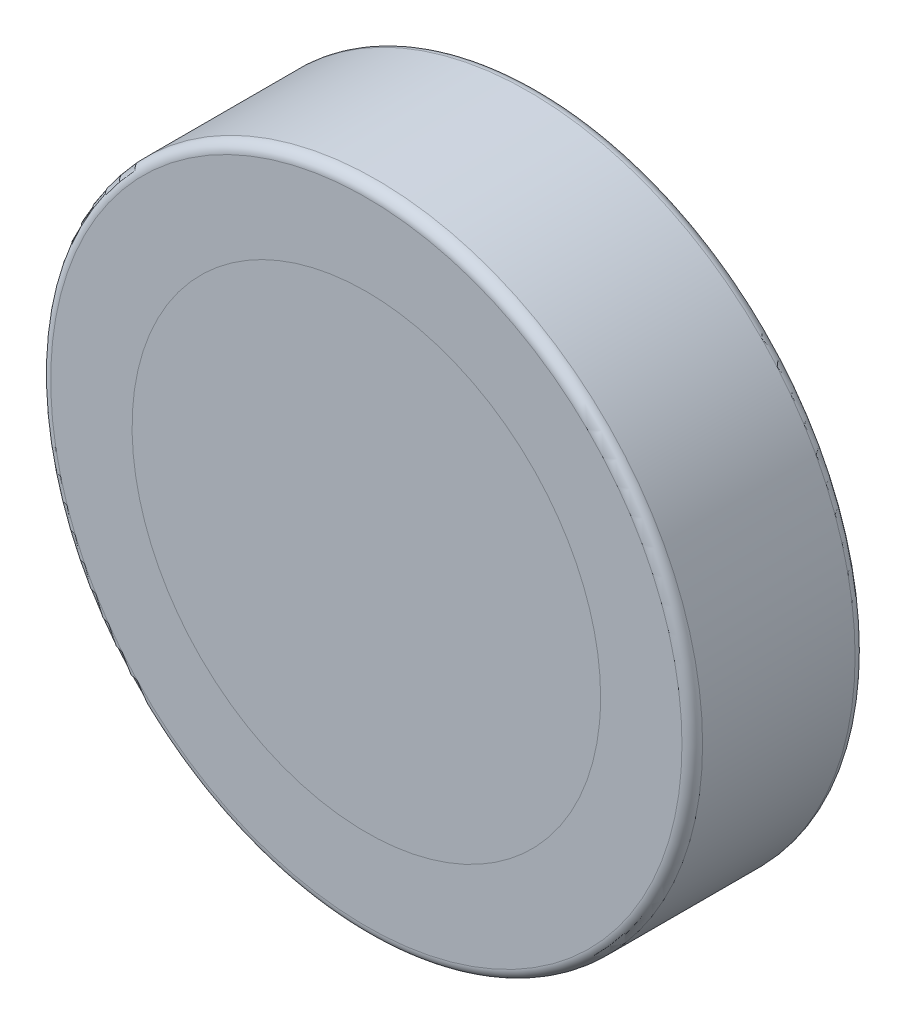
ISO-10303-21;
HEADER;
FILE_DESCRIPTION(('STEP AP214'),'2;1');
FILE_NAME('part.step','',(''),(''),'','','');
FILE_SCHEMA(('AUTOMOTIVE_DESIGN { 1 0 10303 214 1 1 1 1 }'));
ENDSEC;
DATA;
#1=APPLICATION_CONTEXT('core data for automotive mechanical design processes');
#2=APPLICATION_PROTOCOL_DEFINITION('international standard','automotive_design',2000,#1);
#3=PRODUCT_CONTEXT('',#1,'mechanical');
#4=PRODUCT('Part','Part','',(#3));
#5=PRODUCT_RELATED_PRODUCT_CATEGORY('part','',(#4));
#6=PRODUCT_DEFINITION_FORMATION('','',#4);
#7=PRODUCT_DEFINITION_CONTEXT('part definition',#1,'design');
#8=PRODUCT_DEFINITION('design','',#6,#7);
#9=PRODUCT_DEFINITION_SHAPE('','',#8);
#10=(LENGTH_UNIT() NAMED_UNIT(*) SI_UNIT(.MILLI.,.METRE.));
#11=(NAMED_UNIT(*) PLANE_ANGLE_UNIT() SI_UNIT($,.RADIAN.));
#12=(NAMED_UNIT(*) SI_UNIT($,.STERADIAN.) SOLID_ANGLE_UNIT());
#13=UNCERTAINTY_MEASURE_WITH_UNIT(LENGTH_MEASURE(1.E-05),#10,'distance_accuracy_value','');
#14=(GEOMETRIC_REPRESENTATION_CONTEXT(3) GLOBAL_UNCERTAINTY_ASSIGNED_CONTEXT((#13)) GLOBAL_UNIT_ASSIGNED_CONTEXT((#10,
#11,#12)) REPRESENTATION_CONTEXT('',''));
#15=CARTESIAN_POINT('',(0.,0.,0.));
#16=DIRECTION('',(0.,0.,1.));
#17=DIRECTION('',(1.,0.,0.));
#18=AXIS2_PLACEMENT_3D('',#15,#16,#17);
#19=CARTESIAN_POINT('',(0.,2.975,0.813747010949256));
#20=CARTESIAN_POINT('',(-2.975,2.975,0.813747010949256));
#21=CARTESIAN_POINT('',(-2.975,0.,0.813747010949256));
#22=CARTESIAN_POINT('',(-2.975,-2.975,0.813747010949256));
#23=CARTESIAN_POINT('',(0.,-2.975,0.813747010949256));
#24=CARTESIAN_POINT('',(2.975,-2.975,0.813747010949255));
#25=CARTESIAN_POINT('',(2.975,0.,0.813747010949255));
#26=CARTESIAN_POINT('',(2.975,2.975,0.813747010949255));
#27=CARTESIAN_POINT('',(0.,2.975,0.813747010949256));
#28=CARTESIAN_POINT('',(0.,2.95794835873586,0.808934722904776));
#29=CARTESIAN_POINT('',(-2.95794835873586,2.95794835873587,0.808934722904777));
#30=CARTESIAN_POINT('',(-2.95794835873587,0.,0.808934722904777));
#31=CARTESIAN_POINT('',(-2.95794835873587,-2.95794835873586,0.808934722904776));
#32=CARTESIAN_POINT('',(0.,-2.95794835873586,0.808934722904776));
#33=CARTESIAN_POINT('',(2.95794835873586,-2.95794835873587,0.808934722904776));
#34=CARTESIAN_POINT('',(2.95794835873586,0.,0.808934722904776));
#35=CARTESIAN_POINT('',(2.95794835873587,2.95794835873586,0.808934722904776));
#36=CARTESIAN_POINT('',(0.,2.95794835873586,0.808934722904776));
#37=CARTESIAN_POINT('',(0.,2.91872932603113,0.78127548100211));
#38=CARTESIAN_POINT('',(-2.91872932603113,2.91872932603113,0.78127548100211));
#39=CARTESIAN_POINT('',(-2.91872932603113,0.,0.78127548100211));
#40=CARTESIAN_POINT('',(-2.91872932603113,-2.91872932603113,0.78127548100211));
#41=CARTESIAN_POINT('',(0.,-2.91872932603113,0.78127548100211));
#42=CARTESIAN_POINT('',(2.91872932603113,-2.91872932603113,0.781275481002109));
#43=CARTESIAN_POINT('',(2.91872932603113,0.,0.781275481002109));
#44=CARTESIAN_POINT('',(2.91872932603113,2.91872932603113,0.781275481002109));
#45=CARTESIAN_POINT('',(0.,2.91872932603113,0.78127548100211));
#46=CARTESIAN_POINT('',(0.,2.86665441418622,0.754054575757818));
#47=CARTESIAN_POINT('',(-2.86665441418622,2.86665441418622,0.754054575757818));
#48=CARTESIAN_POINT('',(-2.86665441418622,0.,0.754054575757818));
#49=CARTESIAN_POINT('',(-2.86665441418623,-2.86665441418622,0.754054575757818));
#50=CARTESIAN_POINT('',(0.,-2.86665441418622,0.754054575757818));
#51=CARTESIAN_POINT('',(2.86665441418622,-2.86665441418622,0.754054575757818));
#52=CARTESIAN_POINT('',(2.86665441418622,0.,0.754054575757818));
#53=CARTESIAN_POINT('',(2.86665441418622,2.86665441418622,0.754054575757818));
#54=CARTESIAN_POINT('',(0.,2.86665441418622,0.754054575757818));
#55=CARTESIAN_POINT('',(0.,2.80991769813789,0.723340234298779));
#56=CARTESIAN_POINT('',(-2.80991769813789,2.80991769813789,0.723340234298779));
#57=CARTESIAN_POINT('',(-2.80991769813789,0.,0.723340234298779));
#58=CARTESIAN_POINT('',(-2.80991769813789,-2.80991769813789,0.723340234298779));
#59=CARTESIAN_POINT('',(0.,-2.80991769813789,0.723340234298779));
#60=CARTESIAN_POINT('',(2.80991769813788,-2.80991769813789,0.723340234298779));
#61=CARTESIAN_POINT('',(2.80991769813789,0.,0.723340234298778));
#62=CARTESIAN_POINT('',(2.80991769813789,2.80991769813789,0.723340234298779));
#63=CARTESIAN_POINT('',(0.,2.80991769813789,0.723340234298779));
#64=CARTESIAN_POINT('',(0.,2.73784718654364,0.68561835029123));
#65=CARTESIAN_POINT('',(-2.73784718654364,2.73784718654364,0.68561835029123));
#66=CARTESIAN_POINT('',(-2.73784718654364,0.,0.68561835029123));
#67=CARTESIAN_POINT('',(-2.73784718654364,-2.73784718654364,0.68561835029123));
#68=CARTESIAN_POINT('',(0.,-2.73784718654364,0.68561835029123));
#69=CARTESIAN_POINT('',(2.73784718654363,-2.73784718654364,0.68561835029123));
#70=CARTESIAN_POINT('',(2.73784718654364,0.,0.68561835029123));
#71=CARTESIAN_POINT('',(2.73784718654364,2.73784718654363,0.68561835029123));
#72=CARTESIAN_POINT('',(0.,2.73784718654364,0.68561835029123));
#73=CARTESIAN_POINT('',(0.,2.50447570950225,0.567478249050738));
#74=CARTESIAN_POINT('',(-2.50447570950225,2.50447570950225,0.567478249050739));
#75=CARTESIAN_POINT('',(-2.50447570950225,0.,0.567478249050739));
#76=CARTESIAN_POINT('',(-2.50447570950225,-2.50447570950225,0.567478249050739));
#77=CARTESIAN_POINT('',(0.,-2.50447570950225,0.567478249050738));
#78=CARTESIAN_POINT('',(2.50447570950225,-2.50447570950225,0.567478249050738));
#79=CARTESIAN_POINT('',(2.50447570950225,0.,0.567478249050738));
#80=CARTESIAN_POINT('',(2.50447570950225,2.50447570950225,0.567478249050738));
#81=CARTESIAN_POINT('',(0.,2.50447570950225,0.567478249050738));
#82=CARTESIAN_POINT('',(0.,2.16593633190247,0.418234039331355));
#83=CARTESIAN_POINT('',(-2.16593633190247,2.16593633190247,0.418234039331355));
#84=CARTESIAN_POINT('',(-2.16593633190247,0.,0.418234039331355));
#85=CARTESIAN_POINT('',(-2.16593633190247,-2.16593633190247,0.418234039331355));
#86=CARTESIAN_POINT('',(0.,-2.16593633190247,0.418234039331355));
#87=CARTESIAN_POINT('',(2.16593633190247,-2.16593633190247,0.418234039331355));
#88=CARTESIAN_POINT('',(2.16593633190247,0.,0.418234039331355));
#89=CARTESIAN_POINT('',(2.16593633190247,2.16593633190247,0.418234039331355));
#90=CARTESIAN_POINT('',(0.,2.16593633190247,0.418234039331355));
#91=CARTESIAN_POINT('',(0.,1.6196351809738,0.225969525230149));
#92=CARTESIAN_POINT('',(-1.6196351809738,1.6196351809738,0.225969525230149));
#93=CARTESIAN_POINT('',(-1.6196351809738,0.,0.225969525230149));
#94=CARTESIAN_POINT('',(-1.6196351809738,-1.6196351809738,0.225969525230149));
#95=CARTESIAN_POINT('',(0.,-1.6196351809738,0.225969525230149));
#96=CARTESIAN_POINT('',(1.6196351809738,-1.6196351809738,0.225969525230149));
#97=CARTESIAN_POINT('',(1.6196351809738,0.,0.225969525230149));
#98=CARTESIAN_POINT('',(1.6196351809738,1.6196351809738,0.225969525230149));
#99=CARTESIAN_POINT('',(0.,1.6196351809738,0.225969525230149));
#100=CARTESIAN_POINT('',(0.,0.920028472062831,0.05268540982651));
#101=CARTESIAN_POINT('',(-0.92002847206283,0.920028472062832,0.0526854098265101));
#102=CARTESIAN_POINT('',(-0.920028472062832,0.,0.0526854098265102));
#103=CARTESIAN_POINT('',(-0.920028472062833,-0.92002847206283,0.0526854098265102));
#104=CARTESIAN_POINT('',(0.,-0.920028472062831,0.0526854098265101));
#105=CARTESIAN_POINT('',(0.920028472062829,-0.920028472062832,0.05268540982651));
#106=CARTESIAN_POINT('',(0.92002847206283,0.,0.0526854098265099));
#107=CARTESIAN_POINT('',(0.92002847206283,0.92002847206283,0.0526854098265099));
#108=CARTESIAN_POINT('',(0.,0.920028472062831,0.05268540982651));
#109=CARTESIAN_POINT('',(0.,0.332289301784148,0.));
#110=CARTESIAN_POINT('',(-0.332289301784148,0.332289301784149,0.));
#111=CARTESIAN_POINT('',(-0.332289301784149,0.,0.));
#112=CARTESIAN_POINT('',(-0.33228930178415,-0.332289301784147,0.));
#113=CARTESIAN_POINT('',(0.,-0.332289301784148,0.));
#114=CARTESIAN_POINT('',(0.332289301784146,-0.332289301784149,0.));
#115=CARTESIAN_POINT('',(0.332289301784147,0.,0.));
#116=CARTESIAN_POINT('',(0.332289301784148,0.332289301784147,0.));
#117=CARTESIAN_POINT('',(0.,0.332289301784148,0.));
#118=CARTESIAN_POINT('',(0.,0.,0.));
#119=CARTESIAN_POINT('',(0.,0.,0.));
#120=CARTESIAN_POINT('',(0.,0.,0.));
#121=CARTESIAN_POINT('',(0.,0.,0.));
#122=CARTESIAN_POINT('',(0.,0.,0.));
#123=CARTESIAN_POINT('',(0.,0.,0.));
#124=CARTESIAN_POINT('',(0.,0.,0.));
#125=CARTESIAN_POINT('',(0.,0.,0.));
#126=CARTESIAN_POINT('',(0.,0.,0.));
#127=(BOUNDED_SURFACE() B_SPLINE_SURFACE(3,2,((#19,#20,#21,#22,#23,#24,#25,#26,#27),(#28,#29,
#30,#31,#32,#33,#34,#35,#36),(#37,#38,#39,#40,#41,#42,#43,#44,#45),(#46,#47,#48,#49,#50,#51,#52,
#53,#54),(#55,#56,#57,#58,#59,#60,#61,#62,#63),(#64,#65,#66,#67,#68,#69,#70,#71,#72),(#73,#74,
#75,#76,#77,#78,#79,#80,#81),(#82,#83,#84,#85,#86,#87,#88,#89,#90),(#91,#92,#93,#94,#95,#96,#97,
#98,#99),(#100,#101,#102,#103,#104,#105,#106,#107,#108),(#109,#110,#111,#112,#113,#114,#115,
#116,#117),(#118,#119,#120,#121,#122,#123,#124,#125,#126)),.UNSPECIFIED.,.F.,.T.,
.F.) B_SPLINE_SURFACE_WITH_KNOTS((4,1,1,1,1,1,1,1,1,4),(3,2,2,2,3),(0.,0.0170422363020242,
0.0453524777303967,0.056620482856745,0.0790666094501824,0.123606407246282,0.308193861675465,
0.434600923956014,0.680378628539219,1.),(0.,90.,180.,270.,360.),
.UNSPECIFIED.) GEOMETRIC_REPRESENTATION_ITEM() RATIONAL_B_SPLINE_SURFACE(((1.,0.707106781186548,
1.,0.707106781186548,1.,0.707106781186548,1.,0.707106781186548,1.),(1.,0.707106781186548,1.,
0.707106781186548,1.,0.707106781186548,1.,0.707106781186548,1.),(1.,0.707106781186548,1.,
0.707106781186548,1.,0.707106781186548,1.,0.707106781186548,1.),(1.,0.707106781186548,1.,
0.707106781186548,1.,0.707106781186548,1.,0.707106781186548,1.),(1.,0.707106781186548,1.,
0.707106781186548,1.,0.707106781186548,1.,0.707106781186548,1.),(1.,0.707106781186548,1.,
0.707106781186548,1.,0.707106781186548,1.,0.707106781186548,1.),(1.,0.707106781186548,1.,
0.707106781186548,1.,0.707106781186548,1.,0.707106781186548,1.),(1.,0.707106781186548,1.,
0.707106781186548,1.,0.707106781186548,1.,0.707106781186548,1.),(1.,0.707106781186548,1.,
0.707106781186548,1.,0.707106781186548,1.,0.707106781186548,1.),(1.,0.707106781186548,1.,
0.707106781186548,1.,0.707106781186548,1.,0.707106781186548,1.),(1.,0.707106781186548,1.,
0.707106781186548,1.,0.707106781186548,1.,0.707106781186548,1.),(1.,0.707106781186548,1.,
0.707106781186548,1.,0.707106781186548,1.,0.707106781186548,1.))) REPRESENTATION_ITEM('') SURFACE());
#128=CARTESIAN_POINT('',(0.,0.,0.));
#129=CARTESIAN_POINT('',(0.,0.332289301784148,0.));
#130=CARTESIAN_POINT('',(0.,0.920028472062831,0.05268540982651));
#131=CARTESIAN_POINT('',(0.,1.6196351809738,0.225969525230149));
#132=CARTESIAN_POINT('',(0.,2.16593633190247,0.418234039331355));
#133=CARTESIAN_POINT('',(0.,2.50447570950225,0.567478249050738));
#134=CARTESIAN_POINT('',(0.,2.73784718654364,0.68561835029123));
#135=CARTESIAN_POINT('',(0.,2.80991769813789,0.723340234298779));
#136=CARTESIAN_POINT('',(0.,2.86665441418622,0.754054575757818));
#137=CARTESIAN_POINT('',(0.,2.91872932603113,0.78127548100211));
#138=CARTESIAN_POINT('',(0.,2.95794835873586,0.808934722904776));
#139=CARTESIAN_POINT('',(0.,2.975,0.813747010949256));
#140=(BOUNDED_CURVE() B_SPLINE_CURVE(3,(#128,#129,#130,#131,#132,#133,#134,#135,#136,#137,#138,
#139),.UNSPECIFIED.,.F.,.F.) B_SPLINE_CURVE_WITH_KNOTS((4,1,1,1,1,1,1,1,1,4),(0.,
0.319621371460781,0.565399076043986,0.691806138324535,0.876393592753718,0.920933390549818,
0.943379517143255,0.954647522269603,0.982957763697976,1.),
.UNSPECIFIED.) CURVE() GEOMETRIC_REPRESENTATION_ITEM() RATIONAL_B_SPLINE_CURVE((1.,1.,1.,1.,1.,
1.,1.,1.,1.,1.,1.,1.)) REPRESENTATION_ITEM(''));
#141=CARTESIAN_POINT('',(0.,0.,0.));
#142=VERTEX_POINT('',#141);
#143=CARTESIAN_POINT('',(0.,2.975,0.813747010949256));
#144=VERTEX_POINT('',#143);
#145=EDGE_CURVE('E67',#142,#144,#140,.T.);
#146=CARTESIAN_POINT('',(2.975,0.,0.813747010949256));
#147=CARTESIAN_POINT('',(2.975,2.975,0.813747010949256));
#148=CARTESIAN_POINT('',(0.,2.975,0.813747010949256));
#149=(BOUNDED_CURVE() B_SPLINE_CURVE(2,(#146,#147,#148),.UNSPECIFIED.,.F.,
.F.) B_SPLINE_CURVE_WITH_KNOTS((3,3),(0.,1.5707963267949),
.UNSPECIFIED.) CURVE() GEOMETRIC_REPRESENTATION_ITEM() RATIONAL_B_SPLINE_CURVE((1.,
0.707106781186548,1.)) REPRESENTATION_ITEM(''));
#150=CARTESIAN_POINT('',(2.975,0.,0.813747010949256));
#151=VERTEX_POINT('',#150);
#152=EDGE_CURVE('E64',#151,#144,#149,.T.);
#153=CARTESIAN_POINT('',(0.,2.975,0.813747010949256));
#154=CARTESIAN_POINT('',(-2.975,2.975,0.813747010949256));
#155=CARTESIAN_POINT('',(-2.975,0.,0.813747010949256));
#156=CARTESIAN_POINT('',(-2.975,-2.975,0.813747010949256));
#157=CARTESIAN_POINT('',(0.,-2.975,0.813747010949256));
#158=CARTESIAN_POINT('',(2.975,-2.975,0.813747010949256));
#159=CARTESIAN_POINT('',(2.975,0.,0.813747010949256));
#160=(BOUNDED_CURVE() B_SPLINE_CURVE(2,(#153,#154,#155,#156,#157,#158,#159),.UNSPECIFIED.,.F.,
.F.) B_SPLINE_CURVE_WITH_KNOTS((3,2,2,3),(1.5707963267949,3.14159265358979,4.71238898038469,
6.28318530717959),
.UNSPECIFIED.) CURVE() GEOMETRIC_REPRESENTATION_ITEM() RATIONAL_B_SPLINE_CURVE((1.,
0.707106781186548,1.,0.707106781186548,1.,0.707106781186548,1.)) REPRESENTATION_ITEM(''));
#161=EDGE_CURVE('E66',#144,#151,#160,.T.);
#162=ORIENTED_EDGE('',*,*,#145,.T.);
#163=ORIENTED_EDGE('',*,*,#152,.F.);
#164=ORIENTED_EDGE('',*,*,#161,.F.);
#165=ORIENTED_EDGE('',*,*,#145,.F.);
#166=EDGE_LOOP('',(#162,#163,#164,#165));
#167=FACE_BOUND('',#166,.T.);
#168=ADVANCED_FACE('F16',(#167),#127,.T.);
#169=CARTESIAN_POINT('',(0.,0.,0.813747010949256));
#170=DIRECTION('',(0.,0.,-1.));
#171=DIRECTION('',(0.,-1.,0.));
#172=AXIS2_PLACEMENT_3D('',#169,#170,#171);
#173=PLANE('',#172);
#174=CARTESIAN_POINT('',(0.,0.,0.813747010949256));
#175=DIRECTION('',(0.,0.,-1.));
#176=DIRECTION('',(-1.,0.,0.));
#177=AXIS2_PLACEMENT_3D('',#174,#175,#176);
#178=CIRCLE('',#177,3.0625);
#179=CARTESIAN_POINT('',(3.0625,0.,0.813747010949256));
#180=VERTEX_POINT('',#179);
#181=EDGE_CURVE('E25',#180,#180,#178,.T.);
#182=ORIENTED_EDGE('',*,*,#181,.T.);
#183=EDGE_LOOP('',(#182));
#184=FACE_BOUND('',#183,.T.);
#185=ORIENTED_EDGE('',*,*,#161,.T.);
#186=ORIENTED_EDGE('',*,*,#152,.T.);
#187=EDGE_LOOP('',(#185,#186));
#188=FACE_BOUND('',#187,.T.);
#189=ADVANCED_FACE('F71',(#184,#188),#173,.T.);
#190=CARTESIAN_POINT('',(0.,0.,2.493334552329));
#191=CARTESIAN_POINT('',(0.,0.,2.493334552329));
#192=CARTESIAN_POINT('',(0.,0.,2.493334552329));
#193=CARTESIAN_POINT('',(0.,0.,2.493334552329));
#194=CARTESIAN_POINT('',(0.,0.,2.493334552329));
#195=CARTESIAN_POINT('',(0.,0.,2.493334552329));
#196=CARTESIAN_POINT('',(0.,0.,2.493334552329));
#197=CARTESIAN_POINT('',(0.,0.,2.493334552329));
#198=CARTESIAN_POINT('',(0.,0.,2.493334552329));
#199=CARTESIAN_POINT('',(0.,0.757694866313471,2.493334552329));
#200=CARTESIAN_POINT('',(-0.757694866313471,0.757694866313471,2.493334552329));
#201=CARTESIAN_POINT('',(-0.757694866313471,0.,2.493334552329));
#202=CARTESIAN_POINT('',(-0.757694866313471,-0.757694866313471,2.493334552329));
#203=CARTESIAN_POINT('',(0.,-0.757694866313471,2.493334552329));
#204=CARTESIAN_POINT('',(0.757694866313471,-0.757694866313471,2.493334552329));
#205=CARTESIAN_POINT('',(0.757694866313471,0.,2.493334552329));
#206=CARTESIAN_POINT('',(0.757694866313471,0.757694866313471,2.493334552329));
#207=CARTESIAN_POINT('',(0.,0.757694866313471,2.493334552329));
#208=CARTESIAN_POINT('',(0.,1.51538973262694,2.493334552329));
#209=CARTESIAN_POINT('',(-1.51538973262694,1.51538973262694,2.493334552329));
#210=CARTESIAN_POINT('',(-1.51538973262694,0.,2.493334552329));
#211=CARTESIAN_POINT('',(-1.51538973262694,-1.51538973262694,2.493334552329));
#212=CARTESIAN_POINT('',(0.,-1.51538973262694,2.493334552329));
#213=CARTESIAN_POINT('',(1.51538973262694,-1.51538973262694,2.493334552329));
#214=CARTESIAN_POINT('',(1.51538973262694,0.,2.493334552329));
#215=CARTESIAN_POINT('',(1.51538973262694,1.51538973262694,2.493334552329));
#216=CARTESIAN_POINT('',(0.,1.51538973262694,2.493334552329));
#217=CARTESIAN_POINT('',(0.,2.27308459894041,2.493334552329));
#218=CARTESIAN_POINT('',(-2.27308459894041,2.27308459894041,2.493334552329));
#219=CARTESIAN_POINT('',(-2.27308459894041,0.,2.493334552329));
#220=CARTESIAN_POINT('',(-2.27308459894041,-2.27308459894041,2.493334552329));
#221=CARTESIAN_POINT('',(0.,-2.27308459894041,2.493334552329));
#222=CARTESIAN_POINT('',(2.27308459894041,-2.27308459894041,2.493334552329));
#223=CARTESIAN_POINT('',(2.27308459894041,0.,2.493334552329));
#224=CARTESIAN_POINT('',(2.27308459894041,2.27308459894041,2.493334552329));
#225=CARTESIAN_POINT('',(0.,2.27308459894041,2.493334552329));
#226=(BOUNDED_SURFACE() B_SPLINE_SURFACE(3,2,((#190,#191,#192,#193,#194,#195,#196,#197,#198),
(#199,#200,#201,#202,#203,#204,#205,#206,#207),(#208,#209,#210,#211,#212,#213,#214,#215,#216),
(#217,#218,#219,#220,#221,#222,#223,#224,#225)),.UNSPECIFIED.,.F.,.T.,
.F.) B_SPLINE_SURFACE_WITH_KNOTS((4,4),(3,2,2,2,3),(0.,1.),(0.,90.,180.,270.,360.),
.UNSPECIFIED.) GEOMETRIC_REPRESENTATION_ITEM() RATIONAL_B_SPLINE_SURFACE(((1.,0.707106781186548,
1.,0.707106781186548,1.,0.707106781186548,1.,0.707106781186548,1.),(1.,0.707106781186548,1.,
0.707106781186548,1.,0.707106781186548,1.,0.707106781186548,1.),(1.,0.707106781186548,1.,
0.707106781186548,1.,0.707106781186548,1.,0.707106781186548,1.),(1.,0.707106781186548,1.,
0.707106781186548,1.,0.707106781186548,1.,0.707106781186548,1.))) REPRESENTATION_ITEM('') SURFACE());
#227=CARTESIAN_POINT('',(0.,2.27308459894041,2.493334552329));
#228=CARTESIAN_POINT('',(0.,1.51538973262694,2.493334552329));
#229=CARTESIAN_POINT('',(0.,0.757694866313471,2.493334552329));
#230=CARTESIAN_POINT('',(0.,0.,2.493334552329));
#231=(BOUNDED_CURVE() B_SPLINE_CURVE(3,(#227,#228,#229,#230),.UNSPECIFIED.,.F.,
.F.) B_SPLINE_CURVE_WITH_KNOTS((4,4),(0.,1.),
.UNSPECIFIED.) CURVE() GEOMETRIC_REPRESENTATION_ITEM() RATIONAL_B_SPLINE_CURVE((1.,1.,1.,1.)) REPRESENTATION_ITEM(''));
#232=CARTESIAN_POINT('',(0.,2.27308459894041,2.493334552329));
#233=VERTEX_POINT('',#232);
#234=CARTESIAN_POINT('',(0.,0.,2.493334552329));
#235=VERTEX_POINT('',#234);
#236=EDGE_CURVE('E69',#233,#235,#231,.T.);
#237=CARTESIAN_POINT('',(0.,2.27308459894041,2.493334552329));
#238=CARTESIAN_POINT('',(-2.27308459894042,2.27308459894042,2.493334552329));
#239=CARTESIAN_POINT('',(-2.27308459894042,0.,2.493334552329));
#240=CARTESIAN_POINT('',(-2.27308459894042,-2.27308459894041,2.493334552329));
#241=CARTESIAN_POINT('',(0.,-2.27308459894041,2.493334552329));
#242=CARTESIAN_POINT('',(2.27308459894041,-2.27308459894041,2.493334552329));
#243=CARTESIAN_POINT('',(2.27308459894041,0.,2.493334552329));
#244=(BOUNDED_CURVE() B_SPLINE_CURVE(2,(#237,#238,#239,#240,#241,#242,#243),.UNSPECIFIED.,.F.,
.F.) B_SPLINE_CURVE_WITH_KNOTS((3,2,2,3),(1.5707963267949,3.14159265358979,4.71238898038469,
6.28318530717959),
.UNSPECIFIED.) CURVE() GEOMETRIC_REPRESENTATION_ITEM() RATIONAL_B_SPLINE_CURVE((1.,
0.707106781186548,1.,0.707106781186548,1.,0.707106781186548,1.)) REPRESENTATION_ITEM(''));
#245=CARTESIAN_POINT('',(2.27308459894041,0.,2.493334552329));
#246=VERTEX_POINT('',#245);
#247=EDGE_CURVE('E96',#233,#246,#244,.T.);
#248=CARTESIAN_POINT('',(2.27308459894041,0.,2.493334552329));
#249=CARTESIAN_POINT('',(2.27308459894041,2.27308459894041,2.493334552329));
#250=CARTESIAN_POINT('',(0.,2.27308459894041,2.493334552329));
#251=(BOUNDED_CURVE() B_SPLINE_CURVE(2,(#248,#249,#250),.UNSPECIFIED.,.F.,
.F.) B_SPLINE_CURVE_WITH_KNOTS((3,3),(0.,1.5707963267949),
.UNSPECIFIED.) CURVE() GEOMETRIC_REPRESENTATION_ITEM() RATIONAL_B_SPLINE_CURVE((1.,
0.707106781186548,1.)) REPRESENTATION_ITEM(''));
#252=EDGE_CURVE('E92',#246,#233,#251,.T.);
#253=ORIENTED_EDGE('',*,*,#236,.T.);
#254=ORIENTED_EDGE('',*,*,#236,.F.);
#255=ORIENTED_EDGE('',*,*,#247,.T.);
#256=ORIENTED_EDGE('',*,*,#252,.T.);
#257=EDGE_LOOP('',(#253,#254,#255,#256));
#258=FACE_BOUND('',#257,.T.);
#259=ADVANCED_FACE('F128',(#258),#226,.T.);
#260=CARTESIAN_POINT('',(0.,0.,2.493334552329));
#261=DIRECTION('',(0.,0.,1.));
#262=DIRECTION('',(1.,0.,0.));
#263=AXIS2_PLACEMENT_3D('',#260,#261,#262);
#264=PLANE('',#263);
#265=CARTESIAN_POINT('',(0.,0.,2.493334552329));
#266=DIRECTION('',(0.,0.,1.));
#267=DIRECTION('',(1.,0.,0.));
#268=AXIS2_PLACEMENT_3D('',#265,#266,#267);
#269=CIRCLE('',#268,3.0625);
#270=CARTESIAN_POINT('',(3.0625,0.,2.493334552329));
#271=VERTEX_POINT('',#270);
#272=EDGE_CURVE('E10',#271,#271,#269,.T.);
#273=ORIENTED_EDGE('',*,*,#272,.T.);
#274=EDGE_LOOP('',(#273));
#275=FACE_BOUND('',#274,.T.);
#276=ORIENTED_EDGE('',*,*,#252,.F.);
#277=ORIENTED_EDGE('',*,*,#247,.F.);
#278=EDGE_LOOP('',(#276,#277));
#279=FACE_BOUND('',#278,.T.);
#280=ADVANCED_FACE('F130',(#275,#279),#264,.T.);
#281=CARTESIAN_POINT('',(0.,0.,0.813747010949256));
#282=DIRECTION('',(0.,0.,1.));
#283=DIRECTION('',(1.,0.,0.));
#284=AXIS2_PLACEMENT_3D('',#281,#282,#283);
#285=CYLINDRICAL_SURFACE('',#284,3.1625);
#286=CARTESIAN_POINT('',(3.1625,0.,0.813747010949256));
#287=CARTESIAN_POINT('',(3.1625,0.,2.493334552329));
#288=(BOUNDED_CURVE() B_SPLINE_CURVE(1,(#286,#287),.UNSPECIFIED.,.F.,
.F.) B_SPLINE_CURVE_WITH_KNOTS((2,2),(0.,1.),
.UNSPECIFIED.) CURVE() GEOMETRIC_REPRESENTATION_ITEM() RATIONAL_B_SPLINE_CURVE((1.,1.)) REPRESENTATION_ITEM(''));
#289=CARTESIAN_POINT('',(3.1625,0.,0.913747010949256));
#290=VERTEX_POINT('',#289);
#291=CARTESIAN_POINT('',(3.1625,0.,2.393334552329));
#292=VERTEX_POINT('',#291);
#293=EDGE_CURVE('E79',#290,#292,#288,.T.);
#294=ORIENTED_EDGE('',*,*,#293,.F.);
#295=CARTESIAN_POINT('',(0.,0.,0.913747010949256));
#296=DIRECTION('',(0.,0.,-1.));
#297=DIRECTION('',(-1.,0.,0.));
#298=AXIS2_PLACEMENT_3D('',#295,#296,#297);
#299=CIRCLE('',#298,3.1625);
#300=EDGE_CURVE('E87',#290,#290,#299,.F.);
#301=ORIENTED_EDGE('',*,*,#300,.T.);
#302=ORIENTED_EDGE('',*,*,#293,.T.);
#303=CARTESIAN_POINT('',(0.,0.,2.393334552329));
#304=DIRECTION('',(0.,0.,1.));
#305=DIRECTION('',(1.,0.,0.));
#306=AXIS2_PLACEMENT_3D('',#303,#304,#305);
#307=CIRCLE('',#306,3.1625);
#308=EDGE_CURVE('E73',#292,#292,#307,.F.);
#309=ORIENTED_EDGE('',*,*,#308,.T.);
#310=EDGE_LOOP('',(#294,#301,#302,#309));
#311=FACE_BOUND('',#310,.T.);
#312=ADVANCED_FACE('F132',(#311),#285,.T.);
#313=CARTESIAN_POINT('',(0.,0.,0.913747010949256));
#314=DIRECTION('',(0.,0.,-1.));
#315=DIRECTION('',(-1.,0.,0.));
#316=AXIS2_PLACEMENT_3D('',#313,#314,#315);
#317=TOROIDAL_SURFACE('',#316,3.0625,0.1);
#318=CARTESIAN_POINT('',(3.0625,0.,0.913747010949256));
#319=DIRECTION('',(0.,-1.,0.));
#320=DIRECTION('',(1.,0.,0.));
#321=AXIS2_PLACEMENT_3D('',#318,#319,#320);
#322=CIRCLE('',#321,0.1);
#323=EDGE_CURVE('E39',#180,#290,#322,.T.);
#324=ORIENTED_EDGE('',*,*,#323,.F.);
#325=ORIENTED_EDGE('',*,*,#181,.F.);
#326=ORIENTED_EDGE('',*,*,#323,.T.);
#327=ORIENTED_EDGE('',*,*,#300,.F.);
#328=EDGE_LOOP('',(#324,#325,#326,#327));
#329=FACE_BOUND('',#328,.T.);
#330=ADVANCED_FACE('F140',(#329),#317,.T.);
#331=CARTESIAN_POINT('',(0.,0.,2.393334552329));
#332=DIRECTION('',(0.,0.,1.));
#333=DIRECTION('',(1.,0.,0.));
#334=AXIS2_PLACEMENT_3D('',#331,#332,#333);
#335=TOROIDAL_SURFACE('',#334,3.0625,0.1);
#336=CARTESIAN_POINT('',(3.0625,0.,2.393334552329));
#337=DIRECTION('',(0.,-1.,0.));
#338=DIRECTION('',(1.,0.,0.));
#339=AXIS2_PLACEMENT_3D('',#336,#337,#338);
#340=CIRCLE('',#339,0.1);
#341=EDGE_CURVE('E20',#292,#271,#340,.T.);
#342=ORIENTED_EDGE('',*,*,#341,.F.);
#343=ORIENTED_EDGE('',*,*,#308,.F.);
#344=ORIENTED_EDGE('',*,*,#341,.T.);
#345=ORIENTED_EDGE('',*,*,#272,.F.);
#346=EDGE_LOOP('',(#342,#343,#344,#345));
#347=FACE_BOUND('',#346,.T.);
#348=ADVANCED_FACE('F18',(#347),#335,.T.);
#349=CLOSED_SHELL('',(#168,#189,#259,#280,#312,#330,#348));
#350=MANIFOLD_SOLID_BREP('B1',#349);
#351=ADVANCED_BREP_SHAPE_REPRESENTATION('',(#18,#350),#14);
#352=SHAPE_DEFINITION_REPRESENTATION(#9,#351);
ENDSEC;
END-ISO-10303-21;
